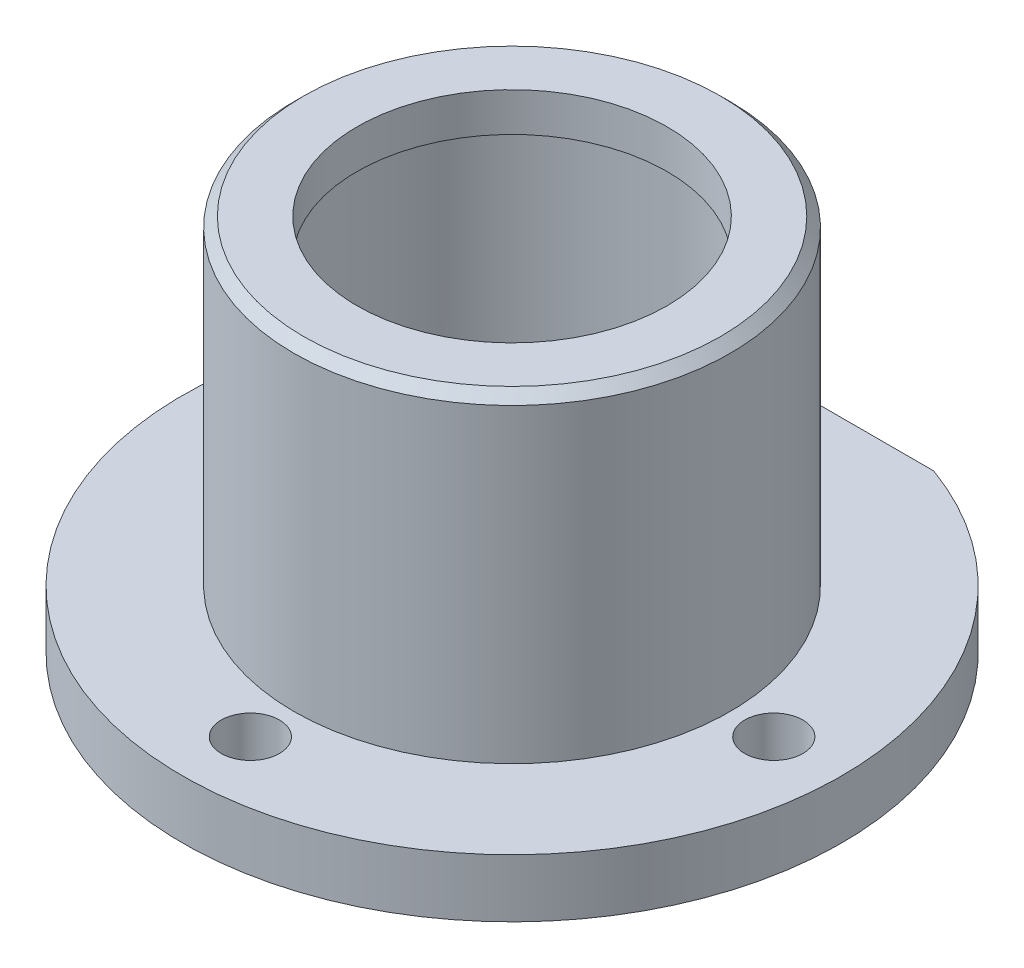
ISO-10303-21;
HEADER;
FILE_DESCRIPTION(('STEP AP214'),'2;1');
FILE_NAME('part.step','',(''),(''),'','','');
FILE_SCHEMA(('AUTOMOTIVE_DESIGN { 1 0 10303 214 1 1 1 1 }'));
ENDSEC;
DATA;
#1=APPLICATION_CONTEXT('core data for automotive mechanical design processes');
#2=APPLICATION_PROTOCOL_DEFINITION('international standard','automotive_design',2000,#1);
#3=PRODUCT_CONTEXT('',#1,'mechanical');
#4=PRODUCT('Part','Part','',(#3));
#5=PRODUCT_RELATED_PRODUCT_CATEGORY('part','',(#4));
#6=PRODUCT_DEFINITION_FORMATION('','',#4);
#7=PRODUCT_DEFINITION_CONTEXT('part definition',#1,'design');
#8=PRODUCT_DEFINITION('design','',#6,#7);
#9=PRODUCT_DEFINITION_SHAPE('','',#8);
#10=(LENGTH_UNIT() NAMED_UNIT(*) SI_UNIT(.MILLI.,.METRE.));
#11=(NAMED_UNIT(*) PLANE_ANGLE_UNIT() SI_UNIT($,.RADIAN.));
#12=(NAMED_UNIT(*) SI_UNIT($,.STERADIAN.) SOLID_ANGLE_UNIT());
#13=UNCERTAINTY_MEASURE_WITH_UNIT(LENGTH_MEASURE(1.E-05),#10,'distance_accuracy_value','');
#14=(GEOMETRIC_REPRESENTATION_CONTEXT(3) GLOBAL_UNCERTAINTY_ASSIGNED_CONTEXT((#13)) GLOBAL_UNIT_ASSIGNED_CONTEXT((#10,
#11,#12)) REPRESENTATION_CONTEXT('',''));
#15=CARTESIAN_POINT('',(0.,0.,0.));
#16=DIRECTION('',(0.,0.,1.));
#17=DIRECTION('',(1.,0.,0.));
#18=AXIS2_PLACEMENT_3D('',#15,#16,#17);
#19=CARTESIAN_POINT('',(0.,6.,0.));
#20=DIRECTION('',(0.,1.,0.));
#21=DIRECTION('',(0.,0.,1.));
#22=AXIS2_PLACEMENT_3D('',#19,#20,#21);
#23=PLANE('',#22);
#24=CARTESIAN_POINT('',(0.,6.,0.));
#25=DIRECTION('',(0.,1.,0.));
#26=DIRECTION('',(0.,0.,1.));
#27=AXIS2_PLACEMENT_3D('',#24,#25,#26);
#28=CIRCLE('',#27,22.5);
#29=CARTESIAN_POINT('',(0.,6.,22.5));
#30=VERTEX_POINT('',#29);
#31=EDGE_CURVE('E105',#30,#30,#28,.T.);
#32=ORIENTED_EDGE('',*,*,#31,.F.);
#33=EDGE_LOOP('',(#32));
#34=FACE_BOUND('',#33,.T.);
#35=CARTESIAN_POINT('',(-1.89084858881472E-13,6.,27.));
#36=DIRECTION('',(0.,1.,0.));
#37=DIRECTION('',(0.,0.,1.));
#38=AXIS2_PLACEMENT_3D('',#35,#36,#37);
#39=CIRCLE('',#38,3.);
#40=CARTESIAN_POINT('',(-1.89084858881472E-13,6.,30.));
#41=VERTEX_POINT('',#40);
#42=EDGE_CURVE('E325',#41,#41,#39,.T.);
#43=ORIENTED_EDGE('',*,*,#42,.F.);
#44=EDGE_LOOP('',(#43));
#45=FACE_BOUND('',#44,.T.);
#46=CARTESIAN_POINT('',(0.,6.,-27.));
#47=DIRECTION('',(0.,1.,0.));
#48=DIRECTION('',(0.,0.,1.));
#49=AXIS2_PLACEMENT_3D('',#46,#47,#48);
#50=CIRCLE('',#49,3.);
#51=CARTESIAN_POINT('',(0.,6.,-24.));
#52=VERTEX_POINT('',#51);
#53=EDGE_CURVE('E94',#52,#52,#50,.T.);
#54=ORIENTED_EDGE('',*,*,#53,.F.);
#55=EDGE_LOOP('',(#54));
#56=FACE_BOUND('',#55,.T.);
#57=CARTESIAN_POINT('',(0.,6.,0.));
#58=DIRECTION('',(0.,1.,0.));
#59=DIRECTION('',(0.,0.,1.));
#60=AXIS2_PLACEMENT_3D('',#57,#58,#59);
#61=CIRCLE('',#60,34.);
#62=CARTESIAN_POINT('',(-11.489125293076,6.,-32.));
#63=VERTEX_POINT('',#62);
#64=CARTESIAN_POINT('',(11.489125293076,6.,-32.));
#65=VERTEX_POINT('',#64);
#66=EDGE_CURVE('E84',#63,#65,#61,.T.);
#67=ORIENTED_EDGE('',*,*,#66,.T.);
#68=DIRECTION('',(-1.,0.,0.));
#69=VECTOR('',#68,1.);
#70=CARTESIAN_POINT('',(11.489125293076,6.,-32.));
#71=LINE('',#70,#69);
#72=EDGE_CURVE('E65',#65,#63,#71,.T.);
#73=ORIENTED_EDGE('',*,*,#72,.T.);
#74=EDGE_LOOP('',(#67,#73));
#75=FACE_BOUND('',#74,.T.);
#76=CARTESIAN_POINT('',(27.,6.,0.));
#77=DIRECTION('',(0.,1.,0.));
#78=DIRECTION('',(0.,0.,1.));
#79=AXIS2_PLACEMENT_3D('',#76,#77,#78);
#80=CIRCLE('',#79,3.);
#81=CARTESIAN_POINT('',(27.,6.,3.00000000000009));
#82=VERTEX_POINT('',#81);
#83=EDGE_CURVE('E333',#82,#82,#80,.T.);
#84=ORIENTED_EDGE('',*,*,#83,.F.);
#85=EDGE_LOOP('',(#84));
#86=FACE_BOUND('',#85,.T.);
#87=CARTESIAN_POINT('',(-27.,6.,-2.8275992658422E-13));
#88=DIRECTION('',(0.,1.,0.));
#89=DIRECTION('',(0.,0.,1.));
#90=AXIS2_PLACEMENT_3D('',#87,#88,#89);
#91=CIRCLE('',#90,3.);
#92=CARTESIAN_POINT('',(-27.,6.,2.99999999999972));
#93=VERTEX_POINT('',#92);
#94=EDGE_CURVE('E317',#93,#93,#91,.T.);
#95=ORIENTED_EDGE('',*,*,#94,.F.);
#96=EDGE_LOOP('',(#95));
#97=FACE_BOUND('',#96,.T.);
#98=ADVANCED_FACE('F47',(#34,#45,#56,#75,#86,#97),#23,.T.);
#99=CARTESIAN_POINT('',(0.,0.,0.));
#100=DIRECTION('',(0.,1.,0.));
#101=DIRECTION('',(0.,0.,1.));
#102=AXIS2_PLACEMENT_3D('',#99,#100,#101);
#103=PLANE('',#102);
#104=CARTESIAN_POINT('',(0.,0.,0.));
#105=DIRECTION('',(0.,1.,0.));
#106=DIRECTION('',(0.,0.,1.));
#107=AXIS2_PLACEMENT_3D('',#104,#105,#106);
#108=CIRCLE('',#107,19.5);
#109=CARTESIAN_POINT('',(0.,0.,19.5));
#110=VERTEX_POINT('',#109);
#111=EDGE_CURVE('E12',#110,#110,#108,.T.);
#112=ORIENTED_EDGE('',*,*,#111,.T.);
#113=EDGE_LOOP('',(#112));
#114=FACE_BOUND('',#113,.T.);
#115=CARTESIAN_POINT('',(0.,0.,0.));
#116=DIRECTION('',(0.,1.,0.));
#117=DIRECTION('',(0.,0.,1.));
#118=AXIS2_PLACEMENT_3D('',#115,#116,#117);
#119=CIRCLE('',#118,34.);
#120=CARTESIAN_POINT('',(-11.489125293076,0.,-32.));
#121=VERTEX_POINT('',#120);
#122=CARTESIAN_POINT('',(11.489125293076,0.,-32.));
#123=VERTEX_POINT('',#122);
#124=EDGE_CURVE('E85',#121,#123,#119,.T.);
#125=ORIENTED_EDGE('',*,*,#124,.F.);
#126=DIRECTION('',(-1.,0.,0.));
#127=VECTOR('',#126,1.);
#128=CARTESIAN_POINT('',(11.489125293076,0.,-32.));
#129=LINE('',#128,#127);
#130=EDGE_CURVE('E73',#123,#121,#129,.T.);
#131=ORIENTED_EDGE('',*,*,#130,.F.);
#132=EDGE_LOOP('',(#125,#131));
#133=FACE_BOUND('',#132,.T.);
#134=CARTESIAN_POINT('',(0.,0.,-27.));
#135=DIRECTION('',(0.,1.,0.));
#136=DIRECTION('',(0.,0.,1.));
#137=AXIS2_PLACEMENT_3D('',#134,#135,#136);
#138=CIRCLE('',#137,3.);
#139=CARTESIAN_POINT('',(0.,0.,-24.));
#140=VERTEX_POINT('',#139);
#141=EDGE_CURVE('E98',#140,#140,#138,.T.);
#142=ORIENTED_EDGE('',*,*,#141,.T.);
#143=EDGE_LOOP('',(#142));
#144=FACE_BOUND('',#143,.T.);
#145=CARTESIAN_POINT('',(27.,0.,0.));
#146=DIRECTION('',(0.,1.,0.));
#147=DIRECTION('',(0.,0.,1.));
#148=AXIS2_PLACEMENT_3D('',#145,#146,#147);
#149=CIRCLE('',#148,3.);
#150=CARTESIAN_POINT('',(27.,0.,3.00000000000009));
#151=VERTEX_POINT('',#150);
#152=EDGE_CURVE('E329',#151,#151,#149,.T.);
#153=ORIENTED_EDGE('',*,*,#152,.T.);
#154=EDGE_LOOP('',(#153));
#155=FACE_BOUND('',#154,.T.);
#156=CARTESIAN_POINT('',(-1.89084858881472E-13,0.,27.));
#157=DIRECTION('',(0.,1.,0.));
#158=DIRECTION('',(0.,0.,1.));
#159=AXIS2_PLACEMENT_3D('',#156,#157,#158);
#160=CIRCLE('',#159,3.);
#161=CARTESIAN_POINT('',(-1.89084858881472E-13,0.,30.));
#162=VERTEX_POINT('',#161);
#163=EDGE_CURVE('E321',#162,#162,#160,.T.);
#164=ORIENTED_EDGE('',*,*,#163,.T.);
#165=EDGE_LOOP('',(#164));
#166=FACE_BOUND('',#165,.T.);
#167=CARTESIAN_POINT('',(-27.,0.,-2.8275992658422E-13));
#168=DIRECTION('',(0.,1.,0.));
#169=DIRECTION('',(0.,0.,1.));
#170=AXIS2_PLACEMENT_3D('',#167,#168,#169);
#171=CIRCLE('',#170,3.);
#172=CARTESIAN_POINT('',(-27.,0.,2.99999999999972));
#173=VERTEX_POINT('',#172);
#174=EDGE_CURVE('E313',#173,#173,#171,.T.);
#175=ORIENTED_EDGE('',*,*,#174,.T.);
#176=EDGE_LOOP('',(#175));
#177=FACE_BOUND('',#176,.T.);
#178=ADVANCED_FACE('F91',(#114,#133,#144,#155,#166,#177),#103,.F.);
#179=CARTESIAN_POINT('',(0.,6.,0.));
#180=DIRECTION('',(0.,-1.,0.));
#181=DIRECTION('',(0.,0.,-1.));
#182=AXIS2_PLACEMENT_3D('',#179,#180,#181);
#183=CYLINDRICAL_SURFACE('',#182,34.);
#184=ORIENTED_EDGE('',*,*,#124,.T.);
#185=DIRECTION('',(0.,-1.,0.));
#186=VECTOR('',#185,1.);
#187=CARTESIAN_POINT('',(11.489125293076,6.,-32.));
#188=LINE('',#187,#186);
#189=EDGE_CURVE('E81',#65,#123,#188,.T.);
#190=ORIENTED_EDGE('',*,*,#189,.F.);
#191=ORIENTED_EDGE('',*,*,#66,.F.);
#192=DIRECTION('',(0.,-1.,0.));
#193=VECTOR('',#192,1.);
#194=CARTESIAN_POINT('',(-11.489125293076,6.,-32.));
#195=LINE('',#194,#193);
#196=EDGE_CURVE('E78',#63,#121,#195,.T.);
#197=ORIENTED_EDGE('',*,*,#196,.T.);
#198=EDGE_LOOP('',(#184,#190,#191,#197));
#199=FACE_BOUND('',#198,.T.);
#200=ADVANCED_FACE('F88',(#199),#183,.T.);
#201=CARTESIAN_POINT('',(11.489125293076,6.,-32.));
#202=DIRECTION('',(0.,0.,1.));
#203=DIRECTION('',(1.,0.,0.));
#204=AXIS2_PLACEMENT_3D('',#201,#202,#203);
#205=PLANE('',#204);
#206=ORIENTED_EDGE('',*,*,#130,.T.);
#207=ORIENTED_EDGE('',*,*,#196,.F.);
#208=ORIENTED_EDGE('',*,*,#72,.F.);
#209=ORIENTED_EDGE('',*,*,#189,.T.);
#210=EDGE_LOOP('',(#206,#207,#208,#209));
#211=FACE_BOUND('',#210,.T.);
#212=ADVANCED_FACE('F77',(#211),#205,.F.);
#213=CARTESIAN_POINT('',(0.,6.,-27.));
#214=DIRECTION('',(0.,-1.,0.));
#215=DIRECTION('',(0.,0.,-1.));
#216=AXIS2_PLACEMENT_3D('',#213,#214,#215);
#217=CYLINDRICAL_SURFACE('',#216,3.);
#218=ORIENTED_EDGE('',*,*,#53,.T.);
#219=EDGE_LOOP('',(#218));
#220=FACE_BOUND('',#219,.T.);
#221=ORIENTED_EDGE('',*,*,#141,.F.);
#222=EDGE_LOOP('',(#221));
#223=FACE_BOUND('',#222,.T.);
#224=ADVANCED_FACE('F139',(#220,#223),#217,.F.);
#225=CARTESIAN_POINT('',(27.,6.,0.));
#226=DIRECTION('',(0.,-1.,0.));
#227=DIRECTION('',(0.,0.,-1.));
#228=AXIS2_PLACEMENT_3D('',#225,#226,#227);
#229=CYLINDRICAL_SURFACE('',#228,3.);
#230=ORIENTED_EDGE('',*,*,#83,.T.);
#231=EDGE_LOOP('',(#230));
#232=FACE_BOUND('',#231,.T.);
#233=ORIENTED_EDGE('',*,*,#152,.F.);
#234=EDGE_LOOP('',(#233));
#235=FACE_BOUND('',#234,.T.);
#236=ADVANCED_FACE('F164',(#232,#235),#229,.F.);
#237=CARTESIAN_POINT('',(-1.89084858881472E-13,6.,27.));
#238=DIRECTION('',(0.,-1.,0.));
#239=DIRECTION('',(0.,0.,-1.));
#240=AXIS2_PLACEMENT_3D('',#237,#238,#239);
#241=CYLINDRICAL_SURFACE('',#240,3.);
#242=ORIENTED_EDGE('',*,*,#42,.T.);
#243=EDGE_LOOP('',(#242));
#244=FACE_BOUND('',#243,.T.);
#245=ORIENTED_EDGE('',*,*,#163,.F.);
#246=EDGE_LOOP('',(#245));
#247=FACE_BOUND('',#246,.T.);
#248=ADVANCED_FACE('F171',(#244,#247),#241,.F.);
#249=CARTESIAN_POINT('',(-27.,6.,-2.8275992658422E-13));
#250=DIRECTION('',(0.,-1.,0.));
#251=DIRECTION('',(0.,0.,-1.));
#252=AXIS2_PLACEMENT_3D('',#249,#250,#251);
#253=CYLINDRICAL_SURFACE('',#252,3.);
#254=ORIENTED_EDGE('',*,*,#94,.T.);
#255=EDGE_LOOP('',(#254));
#256=FACE_BOUND('',#255,.T.);
#257=ORIENTED_EDGE('',*,*,#174,.F.);
#258=EDGE_LOOP('',(#257));
#259=FACE_BOUND('',#258,.T.);
#260=ADVANCED_FACE('F178',(#256,#259),#253,.F.);
#261=CARTESIAN_POINT('',(0.,141.639610306789,0.));
#262=DIRECTION('',(0.,-1.,0.));
#263=DIRECTION('',(0.,0.,-1.));
#264=AXIS2_PLACEMENT_3D('',#261,#262,#263);
#265=CYLINDRICAL_SURFACE('',#264,22.5);
#266=CARTESIAN_POINT('',(0.,38.,0.));
#267=DIRECTION('',(0.,1.,0.));
#268=DIRECTION('',(0.,0.,1.));
#269=AXIS2_PLACEMENT_3D('',#266,#267,#268);
#270=CIRCLE('',#269,22.5);
#271=CARTESIAN_POINT('',(0.,38.,22.5));
#272=VERTEX_POINT('',#271);
#273=EDGE_CURVE('E110',#272,#272,#270,.F.);
#274=ORIENTED_EDGE('',*,*,#273,.T.);
#275=EDGE_LOOP('',(#274));
#276=FACE_BOUND('',#275,.T.);
#277=ORIENTED_EDGE('',*,*,#31,.T.);
#278=EDGE_LOOP('',(#277));
#279=FACE_BOUND('',#278,.T.);
#280=ADVANCED_FACE('F186',(#276,#279),#265,.T.);
#281=CARTESIAN_POINT('',(0.,39.,0.));
#282=DIRECTION('',(0.,1.,0.));
#283=DIRECTION('',(0.,0.,1.));
#284=AXIS2_PLACEMENT_3D('',#281,#282,#283);
#285=PLANE('',#284);
#286=CARTESIAN_POINT('',(0.,39.,0.));
#287=DIRECTION('',(0.,1.,0.));
#288=DIRECTION('',(0.,0.,1.));
#289=AXIS2_PLACEMENT_3D('',#286,#287,#288);
#290=CIRCLE('',#289,21.5);
#291=CARTESIAN_POINT('',(0.,39.,21.5));
#292=VERTEX_POINT('',#291);
#293=EDGE_CURVE('E106',#292,#292,#290,.T.);
#294=ORIENTED_EDGE('',*,*,#293,.T.);
#295=EDGE_LOOP('',(#294));
#296=FACE_BOUND('',#295,.T.);
#297=CARTESIAN_POINT('',(0.,39.,0.));
#298=DIRECTION('',(0.,-1.,0.));
#299=DIRECTION('',(1.,0.,0.));
#300=AXIS2_PLACEMENT_3D('',#297,#298,#299);
#301=CIRCLE('',#300,16.);
#302=CARTESIAN_POINT('',(16.,39.,0.));
#303=VERTEX_POINT('',#302);
#304=EDGE_CURVE('E307',#303,#303,#301,.T.);
#305=ORIENTED_EDGE('',*,*,#304,.T.);
#306=EDGE_LOOP('',(#305));
#307=FACE_BOUND('',#306,.T.);
#308=ADVANCED_FACE('F194',(#296,#307),#285,.T.);
#309=CARTESIAN_POINT('',(0.,0.,0.));
#310=DIRECTION('',(0.,-1.,0.));
#311=DIRECTION('',(1.,0.,0.));
#312=AXIS2_PLACEMENT_3D('',#309,#310,#311);
#313=CYLINDRICAL_SURFACE('',#312,16.);
#314=ORIENTED_EDGE('',*,*,#304,.F.);
#315=EDGE_LOOP('',(#314));
#316=FACE_BOUND('',#315,.T.);
#317=CARTESIAN_POINT('',(0.,35.,0.));
#318=DIRECTION('',(0.,-1.,0.));
#319=DIRECTION('',(1.,0.,0.));
#320=AXIS2_PLACEMENT_3D('',#317,#318,#319);
#321=CIRCLE('',#320,16.);
#322=CARTESIAN_POINT('',(16.,35.,0.));
#323=VERTEX_POINT('',#322);
#324=EDGE_CURVE('E300',#323,#323,#321,.T.);
#325=ORIENTED_EDGE('',*,*,#324,.T.);
#326=EDGE_LOOP('',(#325));
#327=FACE_BOUND('',#326,.T.);
#328=ADVANCED_FACE('F202',(#316,#327),#313,.F.);
#329=CARTESIAN_POINT('',(16.,35.,0.));
#330=DIRECTION('',(0.,1.,0.));
#331=DIRECTION('',(-1.,0.,0.));
#332=AXIS2_PLACEMENT_3D('',#329,#330,#331);
#333=PLANE('',#332);
#334=ORIENTED_EDGE('',*,*,#324,.F.);
#335=EDGE_LOOP('',(#334));
#336=FACE_BOUND('',#335,.T.);
#337=CARTESIAN_POINT('',(0.,35.,0.));
#338=DIRECTION('',(0.,-1.,0.));
#339=DIRECTION('',(1.,0.,0.));
#340=AXIS2_PLACEMENT_3D('',#337,#338,#339);
#341=CIRCLE('',#340,18.5);
#342=CARTESIAN_POINT('',(18.5,35.,0.));
#343=VERTEX_POINT('',#342);
#344=EDGE_CURVE('E303',#343,#343,#341,.T.);
#345=ORIENTED_EDGE('',*,*,#344,.T.);
#346=EDGE_LOOP('',(#345));
#347=FACE_BOUND('',#346,.T.);
#348=ADVANCED_FACE('F211',(#336,#347),#333,.F.);
#349=CARTESIAN_POINT('',(0.,0.,0.));
#350=DIRECTION('',(0.,-1.,0.));
#351=DIRECTION('',(1.,0.,0.));
#352=AXIS2_PLACEMENT_3D('',#349,#350,#351);
#353=CYLINDRICAL_SURFACE('',#352,18.5);
#354=CARTESIAN_POINT('',(0.,1.00000000000001,0.));
#355=DIRECTION('',(0.,1.,0.));
#356=DIRECTION('',(-1.,0.,0.));
#357=AXIS2_PLACEMENT_3D('',#354,#355,#356);
#358=CIRCLE('',#357,18.5);
#359=CARTESIAN_POINT('',(-18.5,1.00000000000001,0.));
#360=VERTEX_POINT('',#359);
#361=EDGE_CURVE('E58',#360,#360,#358,.F.);
#362=ORIENTED_EDGE('',*,*,#361,.T.);
#363=EDGE_LOOP('',(#362));
#364=FACE_BOUND('',#363,.T.);
#365=ORIENTED_EDGE('',*,*,#344,.F.);
#366=EDGE_LOOP('',(#365));
#367=FACE_BOUND('',#366,.T.);
#368=ADVANCED_FACE('F117',(#364,#367),#353,.F.);
#369=CARTESIAN_POINT('',(0.,39.,0.));
#370=DIRECTION('',(0.,-1.,0.));
#371=DIRECTION('',(0.,0.,-1.));
#372=AXIS2_PLACEMENT_3D('',#369,#370,#371);
#373=CONICAL_SURFACE('',#372,21.5,0.785398163397447);
#374=ORIENTED_EDGE('',*,*,#273,.F.);
#375=EDGE_LOOP('',(#374));
#376=FACE_BOUND('',#375,.T.);
#377=ORIENTED_EDGE('',*,*,#293,.F.);
#378=EDGE_LOOP('',(#377));
#379=FACE_BOUND('',#378,.T.);
#380=ADVANCED_FACE('F121',(#376,#379),#373,.T.);
#381=CARTESIAN_POINT('',(0.,1.00000000000001,0.));
#382=DIRECTION('',(0.,-1.,0.));
#383=DIRECTION('',(1.,0.,0.));
#384=AXIS2_PLACEMENT_3D('',#381,#382,#383);
#385=CONICAL_SURFACE('',#384,18.5,0.785398163397452);
#386=ORIENTED_EDGE('',*,*,#111,.F.);
#387=EDGE_LOOP('',(#386));
#388=FACE_BOUND('',#387,.T.);
#389=ORIENTED_EDGE('',*,*,#361,.F.);
#390=EDGE_LOOP('',(#389));
#391=FACE_BOUND('',#390,.T.);
#392=ADVANCED_FACE('F50',(#388,#391),#385,.F.);
#393=CLOSED_SHELL('',(#98,#178,#200,#212,#224,#236,#248,#260,#280,#308,#328,#348,#368,#380,#392));
#394=MANIFOLD_SOLID_BREP('B2',#393);
#395=ADVANCED_BREP_SHAPE_REPRESENTATION('',(#18,#394),#14);
#396=SHAPE_DEFINITION_REPRESENTATION(#9,#395);
ENDSEC;
END-ISO-10303-21;
